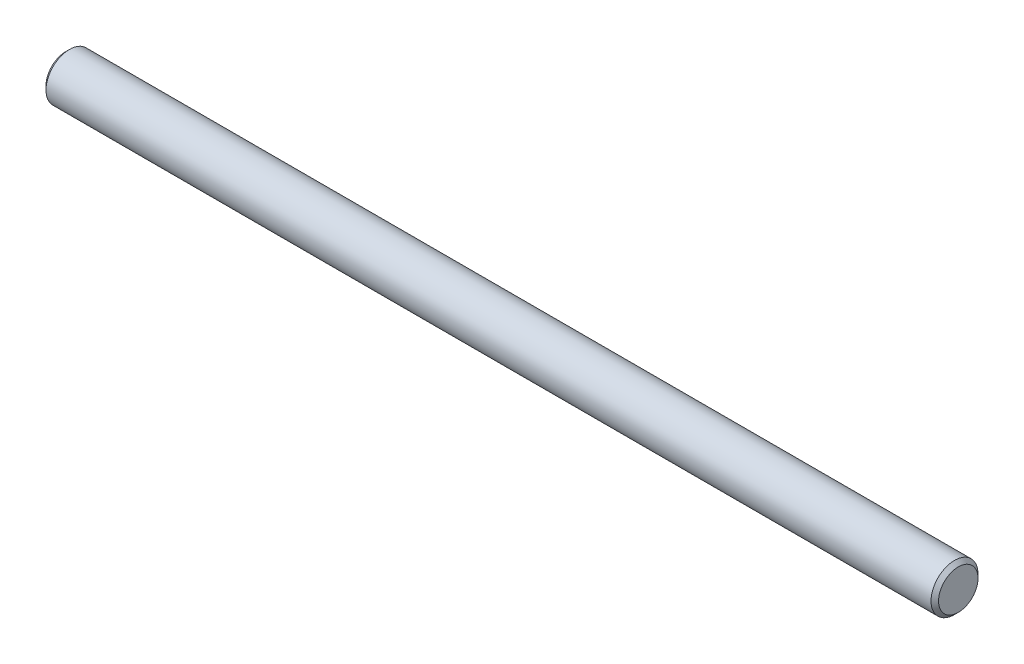
ISO-10303-21;
HEADER;
FILE_DESCRIPTION(('STEP AP214'),'2;1');
FILE_NAME('part.step','',(''),(''),'','','');
FILE_SCHEMA(('AUTOMOTIVE_DESIGN { 1 0 10303 214 1 1 1 1 }'));
ENDSEC;
DATA;
#1=APPLICATION_CONTEXT('core data for automotive mechanical design processes');
#2=APPLICATION_PROTOCOL_DEFINITION('international standard','automotive_design',2000,#1);
#3=PRODUCT_CONTEXT('',#1,'mechanical');
#4=PRODUCT('Part','Part','',(#3));
#5=PRODUCT_RELATED_PRODUCT_CATEGORY('part','',(#4));
#6=PRODUCT_DEFINITION_FORMATION('','',#4);
#7=PRODUCT_DEFINITION_CONTEXT('part definition',#1,'design');
#8=PRODUCT_DEFINITION('design','',#6,#7);
#9=PRODUCT_DEFINITION_SHAPE('','',#8);
#10=(LENGTH_UNIT() NAMED_UNIT(*) SI_UNIT(.MILLI.,.METRE.));
#11=(NAMED_UNIT(*) PLANE_ANGLE_UNIT() SI_UNIT($,.RADIAN.));
#12=(NAMED_UNIT(*) SI_UNIT($,.STERADIAN.) SOLID_ANGLE_UNIT());
#13=UNCERTAINTY_MEASURE_WITH_UNIT(LENGTH_MEASURE(1.E-05),#10,'distance_accuracy_value','');
#14=(GEOMETRIC_REPRESENTATION_CONTEXT(3) GLOBAL_UNCERTAINTY_ASSIGNED_CONTEXT((#13)) GLOBAL_UNIT_ASSIGNED_CONTEXT((#10,
#11,#12)) REPRESENTATION_CONTEXT('',''));
#15=CARTESIAN_POINT('',(0.,0.,0.));
#16=DIRECTION('',(0.,0.,1.));
#17=DIRECTION('',(1.,0.,0.));
#18=AXIS2_PLACEMENT_3D('',#15,#16,#17);
#19=CARTESIAN_POINT('',(30.1625,0.,0.));
#20=DIRECTION('',(1.,0.,0.));
#21=DIRECTION('',(0.,0.,-1.));
#22=AXIS2_PLACEMENT_3D('',#19,#20,#21);
#23=PLANE('',#22);
#24=CARTESIAN_POINT('',(30.1624999999603,0.,0.));
#25=DIRECTION('',(-1.,0.,0.));
#26=DIRECTION('',(0.,-1.,0.));
#27=AXIS2_PLACEMENT_3D('',#24,#25,#26);
#28=CIRCLE('',#27,1.333499999987);
#29=CARTESIAN_POINT('',(30.1624999999603,-1.333499999987,0.));
#30=VERTEX_POINT('',#29);
#31=EDGE_CURVE('E18',#30,#30,#28,.T.);
#32=ORIENTED_EDGE('',*,*,#31,.F.);
#33=EDGE_LOOP('',(#32));
#34=FACE_BOUND('',#33,.T.);
#35=ADVANCED_FACE('F15',(#34),#23,.T.);
#36=CARTESIAN_POINT('',(-30.1625,0.,0.));
#37=DIRECTION('',(1.,0.,0.));
#38=DIRECTION('',(0.,0.,-1.));
#39=AXIS2_PLACEMENT_3D('',#36,#37,#38);
#40=PLANE('',#39);
#41=CARTESIAN_POINT('',(-30.162500000074,0.,0.));
#42=DIRECTION('',(1.,0.,0.));
#43=DIRECTION('',(0.,0.,-1.));
#44=AXIS2_PLACEMENT_3D('',#41,#42,#43);
#45=CIRCLE('',#44,1.333499999987);
#46=CARTESIAN_POINT('',(-30.162500000074,0.,-1.333499999987));
#47=VERTEX_POINT('',#46);
#48=EDGE_CURVE('E27',#47,#47,#45,.T.);
#49=ORIENTED_EDGE('',*,*,#48,.F.);
#50=EDGE_LOOP('',(#49));
#51=FACE_BOUND('',#50,.T.);
#52=ADVANCED_FACE('F38',(#51),#40,.F.);
#53=CARTESIAN_POINT('',(29.9084999999195,0.,0.));
#54=DIRECTION('',(-1.,0.,0.));
#55=DIRECTION('',(0.,-1.,0.));
#56=AXIS2_PLACEMENT_3D('',#53,#54,#55);
#57=CONICAL_SURFACE('',#56,1.58750000008467,0.785398163509345);
#58=CARTESIAN_POINT('',(29.9085,0.,0.));
#59=DIRECTION('',(-1.,0.,0.));
#60=DIRECTION('',(0.,0.,1.));
#61=AXIS2_PLACEMENT_3D('',#58,#59,#60);
#62=CIRCLE('',#61,1.5875);
#63=CARTESIAN_POINT('',(29.9085,0.,1.5875));
#64=VERTEX_POINT('',#63);
#65=EDGE_CURVE('E22',#64,#64,#62,.T.);
#66=ORIENTED_EDGE('',*,*,#65,.F.);
#67=EDGE_LOOP('',(#66));
#68=FACE_BOUND('',#67,.T.);
#69=ORIENTED_EDGE('',*,*,#31,.T.);
#70=EDGE_LOOP('',(#69));
#71=FACE_BOUND('',#70,.T.);
#72=ADVANCED_FACE('F35',(#68,#71),#57,.T.);
#73=CARTESIAN_POINT('',(-29.9085000001469,0.,0.));
#74=DIRECTION('',(1.,0.,0.));
#75=DIRECTION('',(0.,0.,-1.));
#76=AXIS2_PLACEMENT_3D('',#73,#74,#75);
#77=CONICAL_SURFACE('',#76,1.58749999991414,0.785398163397448);
#78=CARTESIAN_POINT('',(-29.9084999999999,0.,0.));
#79=DIRECTION('',(-1.,0.,0.));
#80=DIRECTION('',(0.,0.,1.));
#81=AXIS2_PLACEMENT_3D('',#78,#79,#80);
#82=CIRCLE('',#81,1.5875);
#83=CARTESIAN_POINT('',(-29.9084999999999,0.,1.5875));
#84=VERTEX_POINT('',#83);
#85=EDGE_CURVE('E10',#84,#84,#82,.F.);
#86=ORIENTED_EDGE('',*,*,#85,.F.);
#87=EDGE_LOOP('',(#86));
#88=FACE_BOUND('',#87,.T.);
#89=ORIENTED_EDGE('',*,*,#48,.T.);
#90=EDGE_LOOP('',(#89));
#91=FACE_BOUND('',#90,.T.);
#92=ADVANCED_FACE('F46',(#88,#91),#77,.T.);
#93=CARTESIAN_POINT('',(30.1625,0.,0.));
#94=DIRECTION('',(-1.,0.,0.));
#95=DIRECTION('',(0.,0.,1.));
#96=AXIS2_PLACEMENT_3D('',#93,#94,#95);
#97=CYLINDRICAL_SURFACE('',#96,1.5875);
#98=ORIENTED_EDGE('',*,*,#85,.T.);
#99=EDGE_LOOP('',(#98));
#100=FACE_BOUND('',#99,.T.);
#101=ORIENTED_EDGE('',*,*,#65,.T.);
#102=EDGE_LOOP('',(#101));
#103=FACE_BOUND('',#102,.T.);
#104=ADVANCED_FACE('F44',(#100,#103),#97,.T.);
#105=CLOSED_SHELL('',(#35,#52,#72,#92,#104));
#106=MANIFOLD_SOLID_BREP('B1',#105);
#107=ADVANCED_BREP_SHAPE_REPRESENTATION('',(#18,#106),#14);
#108=SHAPE_DEFINITION_REPRESENTATION(#9,#107);
ENDSEC;
END-ISO-10303-21;
